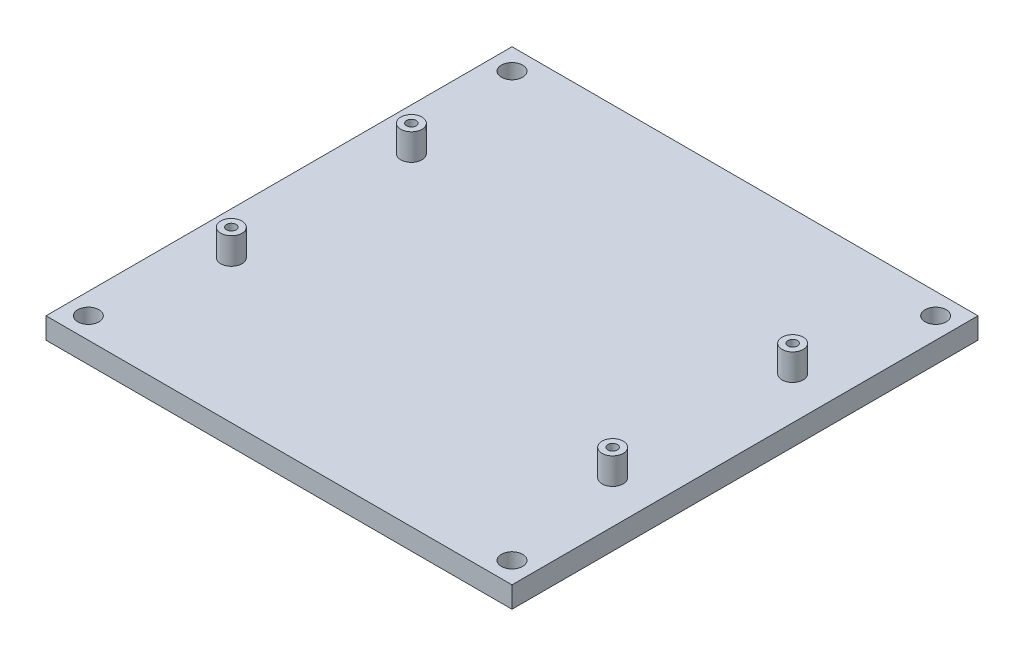
ISO-10303-21;
HEADER;
FILE_DESCRIPTION(('STEP AP214'),'2;1');
FILE_NAME('part.step','',(''),(''),'','','');
FILE_SCHEMA(('AUTOMOTIVE_DESIGN { 1 0 10303 214 1 1 1 1 }'));
ENDSEC;
DATA;
#1=APPLICATION_CONTEXT('core data for automotive mechanical design processes');
#2=APPLICATION_PROTOCOL_DEFINITION('international standard','automotive_design',2000,#1);
#3=PRODUCT_CONTEXT('',#1,'mechanical');
#4=PRODUCT('Part','Part','',(#3));
#5=PRODUCT_RELATED_PRODUCT_CATEGORY('part','',(#4));
#6=PRODUCT_DEFINITION_FORMATION('','',#4);
#7=PRODUCT_DEFINITION_CONTEXT('part definition',#1,'design');
#8=PRODUCT_DEFINITION('design','',#6,#7);
#9=PRODUCT_DEFINITION_SHAPE('','',#8);
#10=(LENGTH_UNIT() NAMED_UNIT(*) SI_UNIT(.MILLI.,.METRE.));
#11=(NAMED_UNIT(*) PLANE_ANGLE_UNIT() SI_UNIT($,.RADIAN.));
#12=(NAMED_UNIT(*) SI_UNIT($,.STERADIAN.) SOLID_ANGLE_UNIT());
#13=UNCERTAINTY_MEASURE_WITH_UNIT(LENGTH_MEASURE(1.E-05),#10,'distance_accuracy_value','');
#14=(GEOMETRIC_REPRESENTATION_CONTEXT(3) GLOBAL_UNCERTAINTY_ASSIGNED_CONTEXT((#13)) GLOBAL_UNIT_ASSIGNED_CONTEXT((#10,
#11,#12)) REPRESENTATION_CONTEXT('',''));
#15=CARTESIAN_POINT('',(0.,0.,0.));
#16=DIRECTION('',(0.,0.,1.));
#17=DIRECTION('',(1.,0.,0.));
#18=AXIS2_PLACEMENT_3D('',#15,#16,#17);
#19=CARTESIAN_POINT('',(69.85,6.35,69.85));
#20=DIRECTION('',(-1.,0.,0.));
#21=DIRECTION('',(0.,0.,1.));
#22=AXIS2_PLACEMENT_3D('',#19,#20,#21);
#23=PLANE('',#22);
#24=DIRECTION('',(0.,0.,-1.));
#25=VECTOR('',#24,1.);
#26=CARTESIAN_POINT('',(69.85,0.,69.85));
#27=LINE('',#26,#25);
#28=CARTESIAN_POINT('',(69.85,0.,69.85));
#29=VERTEX_POINT('',#28);
#30=CARTESIAN_POINT('',(69.85,0.,-69.8500000000001));
#31=VERTEX_POINT('',#30);
#32=EDGE_CURVE('E111',#29,#31,#27,.T.);
#33=ORIENTED_EDGE('',*,*,#32,.T.);
#34=DIRECTION('',(0.,-1.,0.));
#35=VECTOR('',#34,1.);
#36=CARTESIAN_POINT('',(69.85,6.35,-69.8500000000001));
#37=LINE('',#36,#35);
#38=CARTESIAN_POINT('',(69.85,6.35,-69.8500000000001));
#39=VERTEX_POINT('',#38);
#40=EDGE_CURVE('E100',#39,#31,#37,.T.);
#41=ORIENTED_EDGE('',*,*,#40,.F.);
#42=DIRECTION('',(0.,0.,-1.));
#43=VECTOR('',#42,1.);
#44=CARTESIAN_POINT('',(69.85,6.35,69.85));
#45=LINE('',#44,#43);
#46=CARTESIAN_POINT('',(69.85,6.35,69.85));
#47=VERTEX_POINT('',#46);
#48=EDGE_CURVE('E92',#47,#39,#45,.T.);
#49=ORIENTED_EDGE('',*,*,#48,.F.);
#50=DIRECTION('',(0.,-1.,0.));
#51=VECTOR('',#50,1.);
#52=CARTESIAN_POINT('',(69.85,6.35,69.85));
#53=LINE('',#52,#51);
#54=EDGE_CURVE('E107',#47,#29,#53,.T.);
#55=ORIENTED_EDGE('',*,*,#54,.T.);
#56=EDGE_LOOP('',(#33,#41,#49,#55));
#57=FACE_BOUND('',#56,.T.);
#58=ADVANCED_FACE('F39',(#57),#23,.F.);
#59=CARTESIAN_POINT('',(69.85,6.35,-69.8500000000001));
#60=DIRECTION('',(0.,0.,1.));
#61=DIRECTION('',(1.,0.,0.));
#62=AXIS2_PLACEMENT_3D('',#59,#60,#61);
#63=PLANE('',#62);
#64=DIRECTION('',(-1.,0.,0.));
#65=VECTOR('',#64,1.);
#66=CARTESIAN_POINT('',(69.85,0.,-69.8500000000001));
#67=LINE('',#66,#65);
#68=CARTESIAN_POINT('',(-69.8500000000001,0.,-69.8500000000001));
#69=VERTEX_POINT('',#68);
#70=EDGE_CURVE('E98',#31,#69,#67,.T.);
#71=ORIENTED_EDGE('',*,*,#70,.T.);
#72=DIRECTION('',(0.,-1.,0.));
#73=VECTOR('',#72,1.);
#74=CARTESIAN_POINT('',(-69.8500000000001,6.35,-69.8500000000001));
#75=LINE('',#74,#73);
#76=CARTESIAN_POINT('',(-69.8500000000001,6.35,-69.8500000000001));
#77=VERTEX_POINT('',#76);
#78=EDGE_CURVE('E96',#77,#69,#75,.T.);
#79=ORIENTED_EDGE('',*,*,#78,.F.);
#80=DIRECTION('',(-1.,0.,0.));
#81=VECTOR('',#80,1.);
#82=CARTESIAN_POINT('',(69.85,6.35,-69.8500000000001));
#83=LINE('',#82,#81);
#84=EDGE_CURVE('E87',#39,#77,#83,.T.);
#85=ORIENTED_EDGE('',*,*,#84,.F.);
#86=ORIENTED_EDGE('',*,*,#40,.T.);
#87=EDGE_LOOP('',(#71,#79,#85,#86));
#88=FACE_BOUND('',#87,.T.);
#89=ADVANCED_FACE('F97',(#88),#63,.F.);
#90=CARTESIAN_POINT('',(-69.8500000000001,6.35,69.85));
#91=DIRECTION('',(1.,0.,0.));
#92=DIRECTION('',(0.,0.,-1.));
#93=AXIS2_PLACEMENT_3D('',#90,#91,#92);
#94=PLANE('',#93);
#95=DIRECTION('',(0.,0.,1.));
#96=VECTOR('',#95,1.);
#97=CARTESIAN_POINT('',(-69.8500000000001,0.,69.85));
#98=LINE('',#97,#96);
#99=CARTESIAN_POINT('',(-69.8500000000001,0.,69.85));
#100=VERTEX_POINT('',#99);
#101=EDGE_CURVE('E73',#69,#100,#98,.T.);
#102=ORIENTED_EDGE('',*,*,#101,.T.);
#103=DIRECTION('',(0.,-1.,0.));
#104=VECTOR('',#103,1.);
#105=CARTESIAN_POINT('',(-69.8500000000001,6.35,69.85));
#106=LINE('',#105,#104);
#107=CARTESIAN_POINT('',(-69.8500000000001,6.35,69.85));
#108=VERTEX_POINT('',#107);
#109=EDGE_CURVE('E101',#108,#100,#106,.T.);
#110=ORIENTED_EDGE('',*,*,#109,.F.);
#111=DIRECTION('',(0.,0.,1.));
#112=VECTOR('',#111,1.);
#113=CARTESIAN_POINT('',(-69.8500000000001,6.35,69.85));
#114=LINE('',#113,#112);
#115=EDGE_CURVE('E90',#77,#108,#114,.T.);
#116=ORIENTED_EDGE('',*,*,#115,.F.);
#117=ORIENTED_EDGE('',*,*,#78,.T.);
#118=EDGE_LOOP('',(#102,#110,#116,#117));
#119=FACE_BOUND('',#118,.T.);
#120=ADVANCED_FACE('F103',(#119),#94,.F.);
#121=CARTESIAN_POINT('',(69.85,6.35,69.85));
#122=DIRECTION('',(0.,0.,-1.));
#123=DIRECTION('',(-1.,0.,0.));
#124=AXIS2_PLACEMENT_3D('',#121,#122,#123);
#125=PLANE('',#124);
#126=DIRECTION('',(1.,0.,0.));
#127=VECTOR('',#126,1.);
#128=CARTESIAN_POINT('',(69.85,0.,69.85));
#129=LINE('',#128,#127);
#130=EDGE_CURVE('E79',#100,#29,#129,.T.);
#131=ORIENTED_EDGE('',*,*,#130,.T.);
#132=ORIENTED_EDGE('',*,*,#54,.F.);
#133=DIRECTION('',(1.,0.,0.));
#134=VECTOR('',#133,1.);
#135=CARTESIAN_POINT('',(69.85,6.35,69.85));
#136=LINE('',#135,#134);
#137=EDGE_CURVE('E56',#108,#47,#136,.T.);
#138=ORIENTED_EDGE('',*,*,#137,.F.);
#139=ORIENTED_EDGE('',*,*,#109,.T.);
#140=EDGE_LOOP('',(#131,#132,#138,#139));
#141=FACE_BOUND('',#140,.T.);
#142=ADVANCED_FACE('F184',(#141),#125,.F.);
#143=CARTESIAN_POINT('',(0.,6.35,0.));
#144=DIRECTION('',(0.,1.,0.));
#145=DIRECTION('',(0.,0.,1.));
#146=AXIS2_PLACEMENT_3D('',#143,#144,#145);
#147=PLANE('',#146);
#148=CARTESIAN_POINT('',(57.1499999999999,6.35,-26.9875));
#149=DIRECTION('',(0.,1.,0.));
#150=DIRECTION('',(0.,0.,1.));
#151=AXIS2_PLACEMENT_3D('',#148,#149,#150);
#152=CIRCLE('',#151,3.175);
#153=CARTESIAN_POINT('',(57.1499999999999,6.35,-23.8125));
#154=VERTEX_POINT('',#153);
#155=EDGE_CURVE('E433',#154,#154,#152,.T.);
#156=ORIENTED_EDGE('',*,*,#155,.F.);
#157=EDGE_LOOP('',(#156));
#158=FACE_BOUND('',#157,.T.);
#159=CARTESIAN_POINT('',(57.1499999999999,6.35,26.9875));
#160=DIRECTION('',(0.,1.,0.));
#161=DIRECTION('',(0.,0.,1.));
#162=AXIS2_PLACEMENT_3D('',#159,#160,#161);
#163=CIRCLE('',#162,3.175);
#164=CARTESIAN_POINT('',(57.1499999999999,6.35,30.1625));
#165=VERTEX_POINT('',#164);
#166=EDGE_CURVE('E421',#165,#165,#163,.T.);
#167=ORIENTED_EDGE('',*,*,#166,.F.);
#168=EDGE_LOOP('',(#167));
#169=FACE_BOUND('',#168,.T.);
#170=CARTESIAN_POINT('',(-57.1500000000001,6.35,26.9875));
#171=DIRECTION('',(0.,1.,0.));
#172=DIRECTION('',(0.,0.,1.));
#173=AXIS2_PLACEMENT_3D('',#170,#171,#172);
#174=CIRCLE('',#173,3.175);
#175=CARTESIAN_POINT('',(-57.1500000000001,6.35,30.1625));
#176=VERTEX_POINT('',#175);
#177=EDGE_CURVE('E409',#176,#176,#174,.T.);
#178=ORIENTED_EDGE('',*,*,#177,.F.);
#179=EDGE_LOOP('',(#178));
#180=FACE_BOUND('',#179,.T.);
#181=CARTESIAN_POINT('',(-57.1500000000001,6.35,-26.9875));
#182=DIRECTION('',(0.,1.,0.));
#183=DIRECTION('',(0.,0.,1.));
#184=AXIS2_PLACEMENT_3D('',#181,#182,#183);
#185=CIRCLE('',#184,3.175);
#186=CARTESIAN_POINT('',(-57.1500000000001,6.35,-23.8125));
#187=VERTEX_POINT('',#186);
#188=EDGE_CURVE('E373',#187,#187,#185,.T.);
#189=ORIENTED_EDGE('',*,*,#188,.F.);
#190=EDGE_LOOP('',(#189));
#191=FACE_BOUND('',#190,.T.);
#192=CARTESIAN_POINT('',(-63.5000000000001,6.35,-63.5));
#193=DIRECTION('',(0.,1.,0.));
#194=DIRECTION('',(0.,0.,-1.));
#195=AXIS2_PLACEMENT_3D('',#192,#193,#194);
#196=CIRCLE('',#195,3.175);
#197=CARTESIAN_POINT('',(-63.5000000000001,6.35,-66.675));
#198=VERTEX_POINT('',#197);
#199=EDGE_CURVE('E363',#198,#198,#196,.T.);
#200=ORIENTED_EDGE('',*,*,#199,.F.);
#201=EDGE_LOOP('',(#200));
#202=FACE_BOUND('',#201,.T.);
#203=CARTESIAN_POINT('',(63.5000000000001,6.35,-63.5));
#204=DIRECTION('',(0.,1.,0.));
#205=DIRECTION('',(0.,0.,1.));
#206=AXIS2_PLACEMENT_3D('',#203,#204,#205);
#207=CIRCLE('',#206,3.175);
#208=CARTESIAN_POINT('',(63.5000000000001,6.35,-60.325));
#209=VERTEX_POINT('',#208);
#210=EDGE_CURVE('E370',#209,#209,#207,.T.);
#211=ORIENTED_EDGE('',*,*,#210,.F.);
#212=EDGE_LOOP('',(#211));
#213=FACE_BOUND('',#212,.T.);
#214=CARTESIAN_POINT('',(63.5000000000001,6.35,63.5));
#215=DIRECTION('',(0.,1.,0.));
#216=DIRECTION('',(0.,0.,-1.));
#217=AXIS2_PLACEMENT_3D('',#214,#215,#216);
#218=CIRCLE('',#217,3.175);
#219=CARTESIAN_POINT('',(63.5000000000001,6.35,60.325));
#220=VERTEX_POINT('',#219);
#221=EDGE_CURVE('E388',#220,#220,#218,.T.);
#222=ORIENTED_EDGE('',*,*,#221,.F.);
#223=EDGE_LOOP('',(#222));
#224=FACE_BOUND('',#223,.T.);
#225=CARTESIAN_POINT('',(-63.5000000000001,6.35,63.5));
#226=DIRECTION('',(0.,1.,0.));
#227=DIRECTION('',(0.,0.,1.));
#228=AXIS2_PLACEMENT_3D('',#225,#226,#227);
#229=CIRCLE('',#228,3.175);
#230=CARTESIAN_POINT('',(-63.5000000000001,6.35,66.675));
#231=VERTEX_POINT('',#230);
#232=EDGE_CURVE('E380',#231,#231,#229,.T.);
#233=ORIENTED_EDGE('',*,*,#232,.F.);
#234=EDGE_LOOP('',(#233));
#235=FACE_BOUND('',#234,.T.);
#236=ORIENTED_EDGE('',*,*,#48,.T.);
#237=ORIENTED_EDGE('',*,*,#84,.T.);
#238=ORIENTED_EDGE('',*,*,#115,.T.);
#239=ORIENTED_EDGE('',*,*,#137,.T.);
#240=EDGE_LOOP('',(#236,#237,#238,#239));
#241=FACE_BOUND('',#240,.T.);
#242=ADVANCED_FACE('F88',(#158,#169,#180,#191,#202,#213,#224,#235,#241),#147,.T.);
#243=CARTESIAN_POINT('',(0.,0.,0.));
#244=DIRECTION('',(0.,1.,0.));
#245=DIRECTION('',(0.,0.,1.));
#246=AXIS2_PLACEMENT_3D('',#243,#244,#245);
#247=PLANE('',#246);
#248=CARTESIAN_POINT('',(-63.5000000000001,0.,-63.5));
#249=DIRECTION('',(0.,1.,0.));
#250=DIRECTION('',(0.,0.,-1.));
#251=AXIS2_PLACEMENT_3D('',#248,#249,#250);
#252=CIRCLE('',#251,3.175);
#253=CARTESIAN_POINT('',(-63.5000000000001,0.,-66.675));
#254=VERTEX_POINT('',#253);
#255=EDGE_CURVE('E360',#254,#254,#252,.T.);
#256=ORIENTED_EDGE('',*,*,#255,.T.);
#257=EDGE_LOOP('',(#256));
#258=FACE_BOUND('',#257,.T.);
#259=CARTESIAN_POINT('',(63.5000000000001,0.,-63.5));
#260=DIRECTION('',(0.,1.,0.));
#261=DIRECTION('',(0.,0.,1.));
#262=AXIS2_PLACEMENT_3D('',#259,#260,#261);
#263=CIRCLE('',#262,3.175);
#264=CARTESIAN_POINT('',(63.5000000000001,0.,-60.325));
#265=VERTEX_POINT('',#264);
#266=EDGE_CURVE('E392',#265,#265,#263,.T.);
#267=ORIENTED_EDGE('',*,*,#266,.T.);
#268=EDGE_LOOP('',(#267));
#269=FACE_BOUND('',#268,.T.);
#270=CARTESIAN_POINT('',(63.5000000000001,0.,63.5));
#271=DIRECTION('',(0.,1.,0.));
#272=DIRECTION('',(0.,0.,-1.));
#273=AXIS2_PLACEMENT_3D('',#270,#271,#272);
#274=CIRCLE('',#273,3.175);
#275=CARTESIAN_POINT('',(63.5000000000001,0.,60.325));
#276=VERTEX_POINT('',#275);
#277=EDGE_CURVE('E383',#276,#276,#274,.T.);
#278=ORIENTED_EDGE('',*,*,#277,.T.);
#279=EDGE_LOOP('',(#278));
#280=FACE_BOUND('',#279,.T.);
#281=CARTESIAN_POINT('',(-63.5000000000001,0.,63.5));
#282=DIRECTION('',(0.,1.,0.));
#283=DIRECTION('',(0.,0.,1.));
#284=AXIS2_PLACEMENT_3D('',#281,#282,#283);
#285=CIRCLE('',#284,3.175);
#286=CARTESIAN_POINT('',(-63.5000000000001,0.,66.675));
#287=VERTEX_POINT('',#286);
#288=EDGE_CURVE('E115',#287,#287,#285,.T.);
#289=ORIENTED_EDGE('',*,*,#288,.T.);
#290=EDGE_LOOP('',(#289));
#291=FACE_BOUND('',#290,.T.);
#292=ORIENTED_EDGE('',*,*,#32,.F.);
#293=ORIENTED_EDGE('',*,*,#130,.F.);
#294=ORIENTED_EDGE('',*,*,#101,.F.);
#295=ORIENTED_EDGE('',*,*,#70,.F.);
#296=EDGE_LOOP('',(#292,#293,#294,#295));
#297=FACE_BOUND('',#296,.T.);
#298=ADVANCED_FACE('F174',(#258,#269,#280,#291,#297),#247,.F.);
#299=CARTESIAN_POINT('',(-63.5000000000001,0.,63.5));
#300=DIRECTION('',(0.,1.,0.));
#301=DIRECTION('',(0.,0.,1.));
#302=AXIS2_PLACEMENT_3D('',#299,#300,#301);
#303=CYLINDRICAL_SURFACE('',#302,3.175);
#304=ORIENTED_EDGE('',*,*,#288,.F.);
#305=EDGE_LOOP('',(#304));
#306=FACE_BOUND('',#305,.T.);
#307=ORIENTED_EDGE('',*,*,#232,.T.);
#308=EDGE_LOOP('',(#307));
#309=FACE_BOUND('',#308,.T.);
#310=ADVANCED_FACE('F176',(#306,#309),#303,.F.);
#311=CARTESIAN_POINT('',(63.5000000000001,0.,63.5));
#312=DIRECTION('',(0.,1.,0.));
#313=DIRECTION('',(0.,0.,1.));
#314=AXIS2_PLACEMENT_3D('',#311,#312,#313);
#315=CYLINDRICAL_SURFACE('',#314,3.175);
#316=ORIENTED_EDGE('',*,*,#277,.F.);
#317=EDGE_LOOP('',(#316));
#318=FACE_BOUND('',#317,.T.);
#319=ORIENTED_EDGE('',*,*,#221,.T.);
#320=EDGE_LOOP('',(#319));
#321=FACE_BOUND('',#320,.T.);
#322=ADVANCED_FACE('F182',(#318,#321),#315,.F.);
#323=CARTESIAN_POINT('',(63.5000000000001,0.,-63.5));
#324=DIRECTION('',(0.,1.,0.));
#325=DIRECTION('',(0.,0.,1.));
#326=AXIS2_PLACEMENT_3D('',#323,#324,#325);
#327=CYLINDRICAL_SURFACE('',#326,3.175);
#328=ORIENTED_EDGE('',*,*,#266,.F.);
#329=EDGE_LOOP('',(#328));
#330=FACE_BOUND('',#329,.T.);
#331=ORIENTED_EDGE('',*,*,#210,.T.);
#332=EDGE_LOOP('',(#331));
#333=FACE_BOUND('',#332,.T.);
#334=ADVANCED_FACE('F351',(#330,#333),#327,.F.);
#335=CARTESIAN_POINT('',(-63.5000000000001,0.,-63.5));
#336=DIRECTION('',(0.,1.,0.));
#337=DIRECTION('',(0.,0.,1.));
#338=AXIS2_PLACEMENT_3D('',#335,#336,#337);
#339=CYLINDRICAL_SURFACE('',#338,3.175);
#340=ORIENTED_EDGE('',*,*,#255,.F.);
#341=EDGE_LOOP('',(#340));
#342=FACE_BOUND('',#341,.T.);
#343=ORIENTED_EDGE('',*,*,#199,.T.);
#344=EDGE_LOOP('',(#343));
#345=FACE_BOUND('',#344,.T.);
#346=ADVANCED_FACE('F211',(#342,#345),#339,.F.);
#347=CARTESIAN_POINT('',(-57.1500000000001,14.2875,-26.9875));
#348=DIRECTION('',(0.,1.,0.));
#349=DIRECTION('',(0.,0.,1.));
#350=AXIS2_PLACEMENT_3D('',#347,#348,#349);
#351=PLANE('',#350);
#352=CARTESIAN_POINT('',(-57.1500000000001,14.2875,-26.9875));
#353=DIRECTION('',(0.,1.,0.));
#354=DIRECTION('',(0.,0.,1.));
#355=AXIS2_PLACEMENT_3D('',#352,#353,#354);
#356=CIRCLE('',#355,3.175);
#357=CARTESIAN_POINT('',(-57.1500000000001,14.2875,-23.8125));
#358=VERTEX_POINT('',#357);
#359=EDGE_CURVE('E366',#358,#358,#356,.T.);
#360=ORIENTED_EDGE('',*,*,#359,.T.);
#361=EDGE_LOOP('',(#360));
#362=FACE_BOUND('',#361,.T.);
#363=CARTESIAN_POINT('',(-57.1500000000001,14.2875,-26.9875));
#364=DIRECTION('',(0.,1.,0.));
#365=DIRECTION('',(0.,0.,1.));
#366=AXIS2_PLACEMENT_3D('',#363,#364,#365);
#367=CIRCLE('',#366,1.42875000000001);
#368=CARTESIAN_POINT('',(-57.1500000000001,14.2875,-25.55875));
#369=VERTEX_POINT('',#368);
#370=EDGE_CURVE('E403',#369,#369,#367,.T.);
#371=ORIENTED_EDGE('',*,*,#370,.F.);
#372=EDGE_LOOP('',(#371));
#373=FACE_BOUND('',#372,.T.);
#374=ADVANCED_FACE('F216',(#362,#373),#351,.T.);
#375=CARTESIAN_POINT('',(-57.1500000000001,14.2875,-26.9875));
#376=DIRECTION('',(0.,-1.,0.));
#377=DIRECTION('',(0.,0.,-1.));
#378=AXIS2_PLACEMENT_3D('',#375,#376,#377);
#379=CYLINDRICAL_SURFACE('',#378,3.175);
#380=ORIENTED_EDGE('',*,*,#359,.F.);
#381=EDGE_LOOP('',(#380));
#382=FACE_BOUND('',#381,.T.);
#383=ORIENTED_EDGE('',*,*,#188,.T.);
#384=EDGE_LOOP('',(#383));
#385=FACE_BOUND('',#384,.T.);
#386=ADVANCED_FACE('F221',(#382,#385),#379,.T.);
#387=CARTESIAN_POINT('',(-57.1500000000001,14.2875,-26.9875));
#388=DIRECTION('',(0.,-1.,0.));
#389=DIRECTION('',(0.,0.,-1.));
#390=AXIS2_PLACEMENT_3D('',#387,#388,#389);
#391=CYLINDRICAL_SURFACE('',#390,1.42875000000001);
#392=ORIENTED_EDGE('',*,*,#370,.T.);
#393=EDGE_LOOP('',(#392));
#394=FACE_BOUND('',#393,.T.);
#395=CARTESIAN_POINT('',(-57.1500000000001,6.35,-26.9875));
#396=DIRECTION('',(0.,1.,0.));
#397=DIRECTION('',(0.,0.,1.));
#398=AXIS2_PLACEMENT_3D('',#395,#396,#397);
#399=CIRCLE('',#398,1.42875000000001);
#400=CARTESIAN_POINT('',(-57.1500000000001,6.35,-25.55875));
#401=VERTEX_POINT('',#400);
#402=EDGE_CURVE('E128',#401,#401,#399,.F.);
#403=ORIENTED_EDGE('',*,*,#402,.T.);
#404=EDGE_LOOP('',(#403));
#405=FACE_BOUND('',#404,.T.);
#406=ADVANCED_FACE('F232',(#394,#405),#391,.F.);
#407=ORIENTED_EDGE('',*,*,#402,.F.);
#408=EDGE_LOOP('',(#407));
#409=FACE_BOUND('',#408,.T.);
#410=ADVANCED_FACE('F163',(#409),#147,.T.);
#411=CARTESIAN_POINT('',(-57.1500000000001,14.2875,26.9875));
#412=DIRECTION('',(0.,1.,0.));
#413=DIRECTION('',(0.,0.,1.));
#414=AXIS2_PLACEMENT_3D('',#411,#412,#413);
#415=PLANE('',#414);
#416=CARTESIAN_POINT('',(-57.1500000000001,14.2875,26.9875));
#417=DIRECTION('',(0.,1.,0.));
#418=DIRECTION('',(0.,0.,1.));
#419=AXIS2_PLACEMENT_3D('',#416,#417,#418);
#420=CIRCLE('',#419,3.175);
#421=CARTESIAN_POINT('',(-57.1500000000001,14.2875,30.1625));
#422=VERTEX_POINT('',#421);
#423=EDGE_CURVE('E408',#422,#422,#420,.T.);
#424=ORIENTED_EDGE('',*,*,#423,.T.);
#425=EDGE_LOOP('',(#424));
#426=FACE_BOUND('',#425,.T.);
#427=CARTESIAN_POINT('',(-57.1500000000001,14.2875,26.9875));
#428=DIRECTION('',(0.,1.,0.));
#429=DIRECTION('',(0.,0.,1.));
#430=AXIS2_PLACEMENT_3D('',#427,#428,#429);
#431=CIRCLE('',#430,1.42875000000001);
#432=CARTESIAN_POINT('',(-57.1500000000001,14.2875,28.41625));
#433=VERTEX_POINT('',#432);
#434=EDGE_CURVE('E413',#433,#433,#431,.T.);
#435=ORIENTED_EDGE('',*,*,#434,.F.);
#436=EDGE_LOOP('',(#435));
#437=FACE_BOUND('',#436,.T.);
#438=ADVANCED_FACE('F252',(#426,#437),#415,.T.);
#439=CARTESIAN_POINT('',(-57.1500000000001,14.2875,26.9875));
#440=DIRECTION('',(0.,-1.,0.));
#441=DIRECTION('',(0.,0.,-1.));
#442=AXIS2_PLACEMENT_3D('',#439,#440,#441);
#443=CYLINDRICAL_SURFACE('',#442,3.175);
#444=ORIENTED_EDGE('',*,*,#423,.F.);
#445=EDGE_LOOP('',(#444));
#446=FACE_BOUND('',#445,.T.);
#447=ORIENTED_EDGE('',*,*,#177,.T.);
#448=EDGE_LOOP('',(#447));
#449=FACE_BOUND('',#448,.T.);
#450=ADVANCED_FACE('F261',(#446,#449),#443,.T.);
#451=CARTESIAN_POINT('',(-57.1500000000001,14.2875,26.9875));
#452=DIRECTION('',(0.,-1.,0.));
#453=DIRECTION('',(0.,0.,-1.));
#454=AXIS2_PLACEMENT_3D('',#451,#452,#453);
#455=CYLINDRICAL_SURFACE('',#454,1.42875000000001);
#456=ORIENTED_EDGE('',*,*,#434,.T.);
#457=EDGE_LOOP('',(#456));
#458=FACE_BOUND('',#457,.T.);
#459=CARTESIAN_POINT('',(-57.1500000000001,6.35,26.9875));
#460=DIRECTION('',(0.,1.,0.));
#461=DIRECTION('',(0.,0.,1.));
#462=AXIS2_PLACEMENT_3D('',#459,#460,#461);
#463=CIRCLE('',#462,1.42875000000001);
#464=CARTESIAN_POINT('',(-57.1500000000001,6.35,28.41625));
#465=VERTEX_POINT('',#464);
#466=EDGE_CURVE('E132',#465,#465,#463,.F.);
#467=ORIENTED_EDGE('',*,*,#466,.T.);
#468=EDGE_LOOP('',(#467));
#469=FACE_BOUND('',#468,.T.);
#470=ADVANCED_FACE('F161',(#458,#469),#455,.F.);
#471=ORIENTED_EDGE('',*,*,#466,.F.);
#472=EDGE_LOOP('',(#471));
#473=FACE_BOUND('',#472,.T.);
#474=ADVANCED_FACE('F145',(#473),#147,.T.);
#475=CARTESIAN_POINT('',(57.1499999999999,14.2875,26.9875));
#476=DIRECTION('',(0.,1.,0.));
#477=DIRECTION('',(0.,0.,1.));
#478=AXIS2_PLACEMENT_3D('',#475,#476,#477);
#479=PLANE('',#478);
#480=CARTESIAN_POINT('',(57.1499999999999,14.2875,26.9875));
#481=DIRECTION('',(0.,1.,0.));
#482=DIRECTION('',(0.,0.,1.));
#483=AXIS2_PLACEMENT_3D('',#480,#481,#482);
#484=CIRCLE('',#483,3.175);
#485=CARTESIAN_POINT('',(57.1499999999999,14.2875,30.1625));
#486=VERTEX_POINT('',#485);
#487=EDGE_CURVE('E420',#486,#486,#484,.T.);
#488=ORIENTED_EDGE('',*,*,#487,.T.);
#489=EDGE_LOOP('',(#488));
#490=FACE_BOUND('',#489,.T.);
#491=CARTESIAN_POINT('',(57.1499999999999,14.2875,26.9875));
#492=DIRECTION('',(0.,1.,0.));
#493=DIRECTION('',(0.,0.,1.));
#494=AXIS2_PLACEMENT_3D('',#491,#492,#493);
#495=CIRCLE('',#494,1.42875000000001);
#496=CARTESIAN_POINT('',(57.1499999999999,14.2875,28.41625));
#497=VERTEX_POINT('',#496);
#498=EDGE_CURVE('E425',#497,#497,#495,.T.);
#499=ORIENTED_EDGE('',*,*,#498,.F.);
#500=EDGE_LOOP('',(#499));
#501=FACE_BOUND('',#500,.T.);
#502=ADVANCED_FACE('F160',(#490,#501),#479,.T.);
#503=CARTESIAN_POINT('',(57.1499999999999,14.2875,26.9875));
#504=DIRECTION('',(0.,-1.,0.));
#505=DIRECTION('',(0.,0.,-1.));
#506=AXIS2_PLACEMENT_3D('',#503,#504,#505);
#507=CYLINDRICAL_SURFACE('',#506,3.175);
#508=ORIENTED_EDGE('',*,*,#487,.F.);
#509=EDGE_LOOP('',(#508));
#510=FACE_BOUND('',#509,.T.);
#511=ORIENTED_EDGE('',*,*,#166,.T.);
#512=EDGE_LOOP('',(#511));
#513=FACE_BOUND('',#512,.T.);
#514=ADVANCED_FACE('F154',(#510,#513),#507,.T.);
#515=CARTESIAN_POINT('',(57.1499999999999,14.2875,26.9875));
#516=DIRECTION('',(0.,-1.,0.));
#517=DIRECTION('',(0.,0.,-1.));
#518=AXIS2_PLACEMENT_3D('',#515,#516,#517);
#519=CYLINDRICAL_SURFACE('',#518,1.42875000000001);
#520=ORIENTED_EDGE('',*,*,#498,.T.);
#521=EDGE_LOOP('',(#520));
#522=FACE_BOUND('',#521,.T.);
#523=CARTESIAN_POINT('',(57.1499999999999,6.35,26.9875));
#524=DIRECTION('',(0.,1.,0.));
#525=DIRECTION('',(0.,0.,1.));
#526=AXIS2_PLACEMENT_3D('',#523,#524,#525);
#527=CIRCLE('',#526,1.42875000000001);
#528=CARTESIAN_POINT('',(57.1499999999999,6.35,28.41625));
#529=VERTEX_POINT('',#528);
#530=EDGE_CURVE('E48',#529,#529,#527,.F.);
#531=ORIENTED_EDGE('',*,*,#530,.T.);
#532=EDGE_LOOP('',(#531));
#533=FACE_BOUND('',#532,.T.);
#534=ADVANCED_FACE('F139',(#522,#533),#519,.F.);
#535=ORIENTED_EDGE('',*,*,#530,.F.);
#536=EDGE_LOOP('',(#535));
#537=FACE_BOUND('',#536,.T.);
#538=ADVANCED_FACE('F141',(#537),#147,.T.);
#539=CARTESIAN_POINT('',(57.1499999999999,14.2875,-26.9875));
#540=DIRECTION('',(0.,1.,0.));
#541=DIRECTION('',(0.,0.,1.));
#542=AXIS2_PLACEMENT_3D('',#539,#540,#541);
#543=PLANE('',#542);
#544=CARTESIAN_POINT('',(57.1499999999999,14.2875,-26.9875));
#545=DIRECTION('',(0.,1.,0.));
#546=DIRECTION('',(0.,0.,1.));
#547=AXIS2_PLACEMENT_3D('',#544,#545,#546);
#548=CIRCLE('',#547,3.175);
#549=CARTESIAN_POINT('',(57.1499999999999,14.2875,-23.8125));
#550=VERTEX_POINT('',#549);
#551=EDGE_CURVE('E432',#550,#550,#548,.T.);
#552=ORIENTED_EDGE('',*,*,#551,.T.);
#553=EDGE_LOOP('',(#552));
#554=FACE_BOUND('',#553,.T.);
#555=CARTESIAN_POINT('',(57.1499999999999,14.2875,-26.9875));
#556=DIRECTION('',(0.,1.,0.));
#557=DIRECTION('',(0.,0.,1.));
#558=AXIS2_PLACEMENT_3D('',#555,#556,#557);
#559=CIRCLE('',#558,1.42874999999999);
#560=CARTESIAN_POINT('',(57.1499999999999,14.2875,-25.55875));
#561=VERTEX_POINT('',#560);
#562=EDGE_CURVE('E437',#561,#561,#559,.T.);
#563=ORIENTED_EDGE('',*,*,#562,.F.);
#564=EDGE_LOOP('',(#563));
#565=FACE_BOUND('',#564,.T.);
#566=ADVANCED_FACE('F143',(#554,#565),#543,.T.);
#567=CARTESIAN_POINT('',(57.1499999999999,14.2875,-26.9875));
#568=DIRECTION('',(0.,-1.,0.));
#569=DIRECTION('',(0.,0.,-1.));
#570=AXIS2_PLACEMENT_3D('',#567,#568,#569);
#571=CYLINDRICAL_SURFACE('',#570,3.175);
#572=ORIENTED_EDGE('',*,*,#551,.F.);
#573=EDGE_LOOP('',(#572));
#574=FACE_BOUND('',#573,.T.);
#575=ORIENTED_EDGE('',*,*,#155,.T.);
#576=EDGE_LOOP('',(#575));
#577=FACE_BOUND('',#576,.T.);
#578=ADVANCED_FACE('F151',(#574,#577),#571,.T.);
#579=CARTESIAN_POINT('',(57.1499999999999,14.2875,-26.9875));
#580=DIRECTION('',(0.,-1.,0.));
#581=DIRECTION('',(0.,0.,-1.));
#582=AXIS2_PLACEMENT_3D('',#579,#580,#581);
#583=CYLINDRICAL_SURFACE('',#582,1.42874999999999);
#584=ORIENTED_EDGE('',*,*,#562,.T.);
#585=EDGE_LOOP('',(#584));
#586=FACE_BOUND('',#585,.T.);
#587=CARTESIAN_POINT('',(57.1499999999999,6.35,-26.9875));
#588=DIRECTION('',(0.,1.,0.));
#589=DIRECTION('',(0.,0.,1.));
#590=AXIS2_PLACEMENT_3D('',#587,#588,#589);
#591=CIRCLE('',#590,1.42874999999999);
#592=CARTESIAN_POINT('',(57.1499999999999,6.35,-25.55875));
#593=VERTEX_POINT('',#592);
#594=EDGE_CURVE('E11',#593,#593,#591,.F.);
#595=ORIENTED_EDGE('',*,*,#594,.T.);
#596=EDGE_LOOP('',(#595));
#597=FACE_BOUND('',#596,.T.);
#598=ADVANCED_FACE('F165',(#586,#597),#583,.F.);
#599=ORIENTED_EDGE('',*,*,#594,.F.);
#600=EDGE_LOOP('',(#599));
#601=FACE_BOUND('',#600,.T.);
#602=ADVANCED_FACE('F146',(#601),#147,.T.);
#603=CLOSED_SHELL('',(#58,#89,#120,#142,#242,#298,#310,#322,#334,#346,#374,#386,#406,#410,#438,
#450,#470,#474,#502,#514,#534,#538,#566,#578,#598,#602));
#604=MANIFOLD_SOLID_BREP('B2',#603);
#605=ADVANCED_BREP_SHAPE_REPRESENTATION('',(#18,#604),#14);
#606=SHAPE_DEFINITION_REPRESENTATION(#9,#605);
ENDSEC;
END-ISO-10303-21;
